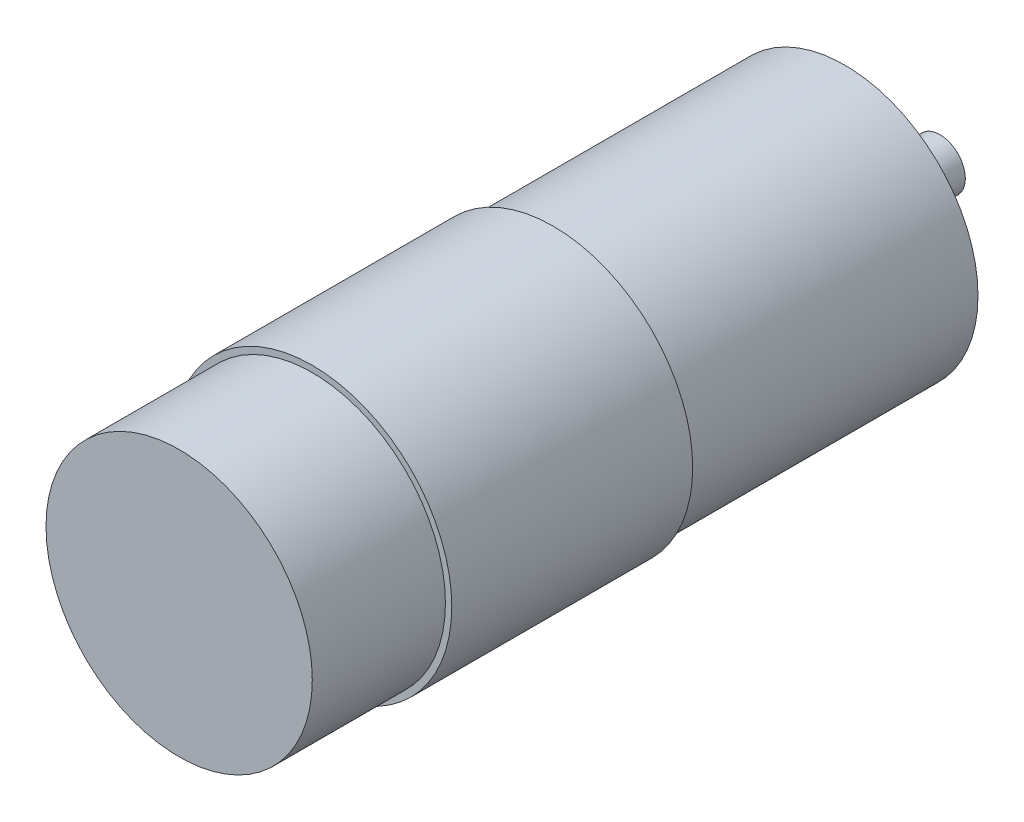
ISO-10303-21;
HEADER;
FILE_DESCRIPTION(('STEP AP214'),'2;1');
FILE_NAME('part.step','',(''),(''),'','','');
FILE_SCHEMA(('AUTOMOTIVE_DESIGN { 1 0 10303 214 1 1 1 1 }'));
ENDSEC;
DATA;
#1=APPLICATION_CONTEXT('core data for automotive mechanical design processes');
#2=APPLICATION_PROTOCOL_DEFINITION('international standard','automotive_design',2000,#1);
#3=PRODUCT_CONTEXT('',#1,'mechanical');
#4=PRODUCT('Part','Part','',(#3));
#5=PRODUCT_RELATED_PRODUCT_CATEGORY('part','',(#4));
#6=PRODUCT_DEFINITION_FORMATION('','',#4);
#7=PRODUCT_DEFINITION_CONTEXT('part definition',#1,'design');
#8=PRODUCT_DEFINITION('design','',#6,#7);
#9=PRODUCT_DEFINITION_SHAPE('','',#8);
#10=(LENGTH_UNIT() NAMED_UNIT(*) SI_UNIT(.MILLI.,.METRE.));
#11=(NAMED_UNIT(*) PLANE_ANGLE_UNIT() SI_UNIT($,.RADIAN.));
#12=(NAMED_UNIT(*) SI_UNIT($,.STERADIAN.) SOLID_ANGLE_UNIT());
#13=UNCERTAINTY_MEASURE_WITH_UNIT(LENGTH_MEASURE(1.E-05),#10,'distance_accuracy_value','');
#14=(GEOMETRIC_REPRESENTATION_CONTEXT(3) GLOBAL_UNCERTAINTY_ASSIGNED_CONTEXT((#13)) GLOBAL_UNIT_ASSIGNED_CONTEXT((#10,
#11,#12)) REPRESENTATION_CONTEXT('',''));
#15=CARTESIAN_POINT('',(0.,0.,0.));
#16=DIRECTION('',(0.,0.,1.));
#17=DIRECTION('',(1.,0.,0.));
#18=AXIS2_PLACEMENT_3D('',#15,#16,#17);
#19=CARTESIAN_POINT('',(0.,0.,105.));
#20=DIRECTION('',(0.,0.,-1.));
#21=DIRECTION('',(-1.,0.,0.));
#22=AXIS2_PLACEMENT_3D('',#19,#20,#21);
#23=CYLINDRICAL_SURFACE('',#22,21.);
#24=CARTESIAN_POINT('',(0.,0.,105.));
#25=DIRECTION('',(0.,0.,1.));
#26=DIRECTION('',(1.,0.,0.));
#27=AXIS2_PLACEMENT_3D('',#24,#25,#26);
#28=CIRCLE('',#27,21.);
#29=CARTESIAN_POINT('',(21.,0.,105.));
#30=VERTEX_POINT('',#29);
#31=EDGE_CURVE('E65',#30,#30,#28,.T.);
#32=ORIENTED_EDGE('',*,*,#31,.F.);
#33=EDGE_LOOP('',(#32));
#34=FACE_BOUND('',#33,.T.);
#35=CARTESIAN_POINT('',(0.,0.,84.));
#36=DIRECTION('',(0.,0.,-1.));
#37=DIRECTION('',(-1.,0.,0.));
#38=AXIS2_PLACEMENT_3D('',#35,#36,#37);
#39=CIRCLE('',#38,21.);
#40=CARTESIAN_POINT('',(-21.,0.,84.));
#41=VERTEX_POINT('',#40);
#42=EDGE_CURVE('E11',#41,#41,#39,.T.);
#43=ORIENTED_EDGE('',*,*,#42,.F.);
#44=EDGE_LOOP('',(#43));
#45=FACE_BOUND('',#44,.T.);
#46=ADVANCED_FACE('F57',(#34,#45),#23,.T.);
#47=CARTESIAN_POINT('',(0.,0.,105.));
#48=DIRECTION('',(0.,0.,1.));
#49=DIRECTION('',(1.,0.,0.));
#50=AXIS2_PLACEMENT_3D('',#47,#48,#49);
#51=PLANE('',#50);
#52=ORIENTED_EDGE('',*,*,#31,.T.);
#53=EDGE_LOOP('',(#52));
#54=FACE_BOUND('',#53,.T.);
#55=ADVANCED_FACE('F174',(#54),#51,.T.);
#56=CARTESIAN_POINT('',(0.,0.,84.));
#57=DIRECTION('',(0.,0.,-1.));
#58=DIRECTION('',(-1.,0.,0.));
#59=AXIS2_PLACEMENT_3D('',#56,#57,#58);
#60=CYLINDRICAL_SURFACE('',#59,22.);
#61=CARTESIAN_POINT('',(0.,0.,84.));
#62=DIRECTION('',(0.,0.,-1.));
#63=DIRECTION('',(-1.,0.,0.));
#64=AXIS2_PLACEMENT_3D('',#61,#62,#63);
#65=CIRCLE('',#64,22.);
#66=CARTESIAN_POINT('',(-22.,0.,84.));
#67=VERTEX_POINT('',#66);
#68=EDGE_CURVE('E83',#67,#67,#65,.T.);
#69=ORIENTED_EDGE('',*,*,#68,.T.);
#70=EDGE_LOOP('',(#69));
#71=FACE_BOUND('',#70,.T.);
#72=CARTESIAN_POINT('',(0.,0.,46.));
#73=DIRECTION('',(0.,0.,-1.));
#74=DIRECTION('',(-1.,0.,0.));
#75=AXIS2_PLACEMENT_3D('',#72,#73,#74);
#76=CIRCLE('',#75,22.);
#77=CARTESIAN_POINT('',(-22.,0.,46.));
#78=VERTEX_POINT('',#77);
#79=EDGE_CURVE('E79',#78,#78,#76,.T.);
#80=ORIENTED_EDGE('',*,*,#79,.F.);
#81=EDGE_LOOP('',(#80));
#82=FACE_BOUND('',#81,.T.);
#83=ADVANCED_FACE('F179',(#71,#82),#60,.T.);
#84=CARTESIAN_POINT('',(0.,0.,84.));
#85=DIRECTION('',(0.,0.,-1.));
#86=DIRECTION('',(-1.,0.,0.));
#87=AXIS2_PLACEMENT_3D('',#84,#85,#86);
#88=PLANE('',#87);
#89=ORIENTED_EDGE('',*,*,#42,.T.);
#90=EDGE_LOOP('',(#89));
#91=FACE_BOUND('',#90,.T.);
#92=ORIENTED_EDGE('',*,*,#68,.F.);
#93=EDGE_LOOP('',(#92));
#94=FACE_BOUND('',#93,.T.);
#95=ADVANCED_FACE('F185',(#91,#94),#88,.F.);
#96=CARTESIAN_POINT('',(0.,0.,46.));
#97=DIRECTION('',(0.,0.,-1.));
#98=DIRECTION('',(-1.,0.,0.));
#99=AXIS2_PLACEMENT_3D('',#96,#97,#98);
#100=PLANE('',#99);
#101=CARTESIAN_POINT('',(0.,0.,46.));
#102=DIRECTION('',(0.,0.,-1.));
#103=DIRECTION('',(-1.,0.,0.));
#104=AXIS2_PLACEMENT_3D('',#101,#102,#103);
#105=CIRCLE('',#104,21.);
#106=CARTESIAN_POINT('',(-21.,0.,46.));
#107=VERTEX_POINT('',#106);
#108=EDGE_CURVE('E76',#107,#107,#105,.T.);
#109=ORIENTED_EDGE('',*,*,#108,.F.);
#110=EDGE_LOOP('',(#109));
#111=FACE_BOUND('',#110,.T.);
#112=ORIENTED_EDGE('',*,*,#79,.T.);
#113=EDGE_LOOP('',(#112));
#114=FACE_BOUND('',#113,.T.);
#115=ADVANCED_FACE('F154',(#111,#114),#100,.T.);
#116=CARTESIAN_POINT('',(0.,0.,0.));
#117=DIRECTION('',(0.,0.,1.));
#118=DIRECTION('',(1.,0.,0.));
#119=AXIS2_PLACEMENT_3D('',#116,#117,#118);
#120=PLANE('',#119);
#121=CARTESIAN_POINT('',(17.5,0.,0.));
#122=DIRECTION('',(0.,0.,-1.));
#123=DIRECTION('',(0.,-1.,0.));
#124=AXIS2_PLACEMENT_3D('',#121,#122,#123);
#125=CIRCLE('',#124,1.5);
#126=CARTESIAN_POINT('',(16.,0.,0.));
#127=VERTEX_POINT('',#126);
#128=EDGE_CURVE('E134',#127,#127,#125,.T.);
#129=ORIENTED_EDGE('',*,*,#128,.F.);
#130=EDGE_LOOP('',(#129));
#131=FACE_BOUND('',#130,.T.);
#132=CARTESIAN_POINT('',(0.,17.5,0.));
#133=DIRECTION('',(0.,0.,-1.));
#134=DIRECTION('',(1.,0.,0.));
#135=AXIS2_PLACEMENT_3D('',#132,#133,#134);
#136=CIRCLE('',#135,1.5);
#137=CARTESIAN_POINT('',(-1.5,17.5,0.));
#138=VERTEX_POINT('',#137);
#139=EDGE_CURVE('E126',#138,#138,#136,.T.);
#140=ORIENTED_EDGE('',*,*,#139,.F.);
#141=EDGE_LOOP('',(#140));
#142=FACE_BOUND('',#141,.T.);
#143=CARTESIAN_POINT('',(-17.5,-1.83302770289265E-13,0.));
#144=DIRECTION('',(0.,0.,-1.));
#145=DIRECTION('',(0.,1.,0.));
#146=AXIS2_PLACEMENT_3D('',#143,#144,#145);
#147=CIRCLE('',#146,1.5);
#148=CARTESIAN_POINT('',(-19.,-1.83302770289265E-13,0.));
#149=VERTEX_POINT('',#148);
#150=EDGE_CURVE('E118',#149,#149,#147,.T.);
#151=ORIENTED_EDGE('',*,*,#150,.F.);
#152=EDGE_LOOP('',(#151));
#153=FACE_BOUND('',#152,.T.);
#154=CARTESIAN_POINT('',(0.,-17.5,0.));
#155=DIRECTION('',(0.,0.,-1.));
#156=DIRECTION('',(-1.,0.,0.));
#157=AXIS2_PLACEMENT_3D('',#154,#155,#156);
#158=CIRCLE('',#157,1.5);
#159=CARTESIAN_POINT('',(-1.5,-17.5,0.));
#160=VERTEX_POINT('',#159);
#161=EDGE_CURVE('E110',#160,#160,#158,.T.);
#162=ORIENTED_EDGE('',*,*,#161,.F.);
#163=EDGE_LOOP('',(#162));
#164=FACE_BOUND('',#163,.T.);
#165=CARTESIAN_POINT('',(0.,0.,0.));
#166=DIRECTION('',(0.,0.,1.));
#167=DIRECTION('',(1.,0.,0.));
#168=AXIS2_PLACEMENT_3D('',#165,#166,#167);
#169=CIRCLE('',#168,12.5);
#170=CARTESIAN_POINT('',(12.5,0.,0.));
#171=VERTEX_POINT('',#170);
#172=EDGE_CURVE('E94',#171,#171,#169,.T.);
#173=ORIENTED_EDGE('',*,*,#172,.T.);
#174=EDGE_LOOP('',(#173));
#175=FACE_BOUND('',#174,.T.);
#176=CARTESIAN_POINT('',(0.,0.,0.));
#177=DIRECTION('',(0.,0.,1.));
#178=DIRECTION('',(1.,0.,0.));
#179=AXIS2_PLACEMENT_3D('',#176,#177,#178);
#180=CIRCLE('',#179,21.);
#181=CARTESIAN_POINT('',(21.,0.,0.));
#182=VERTEX_POINT('',#181);
#183=EDGE_CURVE('E70',#182,#182,#180,.T.);
#184=ORIENTED_EDGE('',*,*,#183,.F.);
#185=EDGE_LOOP('',(#184));
#186=FACE_BOUND('',#185,.T.);
#187=ADVANCED_FACE('F151',(#131,#142,#153,#164,#175,#186),#120,.F.);
#188=ORIENTED_EDGE('',*,*,#108,.T.);
#189=EDGE_LOOP('',(#188));
#190=FACE_BOUND('',#189,.T.);
#191=ORIENTED_EDGE('',*,*,#183,.T.);
#192=EDGE_LOOP('',(#191));
#193=FACE_BOUND('',#192,.T.);
#194=ADVANCED_FACE('F59',(#190,#193),#23,.T.);
#195=CARTESIAN_POINT('',(0.,0.,-2.));
#196=DIRECTION('',(0.,0.,1.));
#197=DIRECTION('',(1.,0.,0.));
#198=AXIS2_PLACEMENT_3D('',#195,#196,#197);
#199=CYLINDRICAL_SURFACE('',#198,12.5);
#200=CARTESIAN_POINT('',(0.,0.,-2.));
#201=DIRECTION('',(0.,0.,1.));
#202=DIRECTION('',(1.,0.,0.));
#203=AXIS2_PLACEMENT_3D('',#200,#201,#202);
#204=CIRCLE('',#203,12.5);
#205=CARTESIAN_POINT('',(12.5,0.,-2.));
#206=VERTEX_POINT('',#205);
#207=EDGE_CURVE('E92',#206,#206,#204,.T.);
#208=ORIENTED_EDGE('',*,*,#207,.T.);
#209=EDGE_LOOP('',(#208));
#210=FACE_BOUND('',#209,.T.);
#211=ORIENTED_EDGE('',*,*,#172,.F.);
#212=EDGE_LOOP('',(#211));
#213=FACE_BOUND('',#212,.T.);
#214=ADVANCED_FACE('F166',(#210,#213),#199,.T.);
#215=CARTESIAN_POINT('',(0.,0.,-2.));
#216=DIRECTION('',(0.,0.,1.));
#217=DIRECTION('',(1.,0.,0.));
#218=AXIS2_PLACEMENT_3D('',#215,#216,#217);
#219=PLANE('',#218);
#220=CARTESIAN_POINT('',(0.,0.,-2.));
#221=DIRECTION('',(0.,0.,1.));
#222=DIRECTION('',(1.,0.,0.));
#223=AXIS2_PLACEMENT_3D('',#220,#221,#222);
#224=CIRCLE('',#223,4.);
#225=CARTESIAN_POINT('',(4.,0.,-2.));
#226=VERTEX_POINT('',#225);
#227=EDGE_CURVE('E102',#226,#226,#224,.T.);
#228=ORIENTED_EDGE('',*,*,#227,.T.);
#229=EDGE_LOOP('',(#228));
#230=FACE_BOUND('',#229,.T.);
#231=ORIENTED_EDGE('',*,*,#207,.F.);
#232=EDGE_LOOP('',(#231));
#233=FACE_BOUND('',#232,.T.);
#234=ADVANCED_FACE('F170',(#230,#233),#219,.F.);
#235=CARTESIAN_POINT('',(0.,0.,-15.));
#236=DIRECTION('',(0.,0.,1.));
#237=DIRECTION('',(1.,0.,0.));
#238=AXIS2_PLACEMENT_3D('',#235,#236,#237);
#239=CYLINDRICAL_SURFACE('',#238,4.);
#240=CARTESIAN_POINT('',(0.,0.,-15.));
#241=DIRECTION('',(0.,0.,1.));
#242=DIRECTION('',(1.,0.,0.));
#243=AXIS2_PLACEMENT_3D('',#240,#241,#242);
#244=CIRCLE('',#243,4.);
#245=CARTESIAN_POINT('',(4.,0.,-15.));
#246=VERTEX_POINT('',#245);
#247=EDGE_CURVE('E98',#246,#246,#244,.T.);
#248=CARTESIAN_POINT('',(4.,0.,-15.));
#249=CARTESIAN_POINT('',(4.,0.,-14.8645833333333));
#250=CARTESIAN_POINT('',(4.,0.,-14.7291666666667));
#251=CARTESIAN_POINT('',(4.,0.,-14.4583333333333));
#252=CARTESIAN_POINT('',(4.,0.,-14.3229166666667));
#253=CARTESIAN_POINT('',(4.,0.,-14.0520833333333));
#254=CARTESIAN_POINT('',(4.,0.,-13.9166666666667));
#255=CARTESIAN_POINT('',(4.,0.,-13.6458333333333));
#256=CARTESIAN_POINT('',(4.,0.,-13.5104166666667));
#257=CARTESIAN_POINT('',(4.,0.,-13.2395833333333));
#258=CARTESIAN_POINT('',(4.,0.,-13.1041666666667));
#259=CARTESIAN_POINT('',(4.,0.,-12.8333333333333));
#260=CARTESIAN_POINT('',(4.,0.,-12.6979166666667));
#261=CARTESIAN_POINT('',(4.,0.,-12.4270833333333));
#262=CARTESIAN_POINT('',(4.,0.,-12.2916666666667));
#263=CARTESIAN_POINT('',(4.,0.,-12.0208333333333));
#264=CARTESIAN_POINT('',(4.,0.,-11.8854166666667));
#265=CARTESIAN_POINT('',(4.,0.,-11.6145833333333));
#266=CARTESIAN_POINT('',(4.,0.,-11.4791666666667));
#267=CARTESIAN_POINT('',(4.,0.,-11.2083333333333));
#268=CARTESIAN_POINT('',(4.,0.,-11.0729166666667));
#269=CARTESIAN_POINT('',(4.,0.,-10.8020833333333));
#270=CARTESIAN_POINT('',(4.,0.,-10.6666666666667));
#271=CARTESIAN_POINT('',(4.,0.,-10.3958333333333));
#272=CARTESIAN_POINT('',(4.,0.,-10.2604166666667));
#273=CARTESIAN_POINT('',(4.,0.,-9.98958333333333));
#274=CARTESIAN_POINT('',(4.,0.,-9.85416666666667));
#275=CARTESIAN_POINT('',(4.,0.,-9.58333333333333));
#276=CARTESIAN_POINT('',(4.,0.,-9.44791666666667));
#277=CARTESIAN_POINT('',(4.,0.,-9.17708333333333));
#278=CARTESIAN_POINT('',(4.,0.,-9.04166666666667));
#279=CARTESIAN_POINT('',(4.,0.,-8.77083333333333));
#280=CARTESIAN_POINT('',(4.,0.,-8.63541666666667));
#281=CARTESIAN_POINT('',(4.,0.,-8.36458333333333));
#282=CARTESIAN_POINT('',(4.,0.,-8.22916666666667));
#283=CARTESIAN_POINT('',(4.,0.,-7.95833333333333));
#284=CARTESIAN_POINT('',(4.,0.,-7.82291666666667));
#285=CARTESIAN_POINT('',(4.,0.,-7.55208333333333));
#286=CARTESIAN_POINT('',(4.,0.,-7.41666666666667));
#287=CARTESIAN_POINT('',(4.,0.,-7.14583333333333));
#288=CARTESIAN_POINT('',(4.,0.,-7.01041666666667));
#289=CARTESIAN_POINT('',(4.,0.,-6.73958333333333));
#290=CARTESIAN_POINT('',(4.,0.,-6.60416666666667));
#291=CARTESIAN_POINT('',(4.,0.,-6.33333333333333));
#292=CARTESIAN_POINT('',(4.,0.,-6.19791666666667));
#293=CARTESIAN_POINT('',(4.,0.,-5.92708333333333));
#294=CARTESIAN_POINT('',(4.,0.,-5.79166666666667));
#295=CARTESIAN_POINT('',(4.,0.,-5.52083333333333));
#296=CARTESIAN_POINT('',(4.,0.,-5.38541666666667));
#297=CARTESIAN_POINT('',(4.,0.,-5.11458333333333));
#298=CARTESIAN_POINT('',(4.,0.,-4.97916666666667));
#299=CARTESIAN_POINT('',(4.,0.,-4.70833333333333));
#300=CARTESIAN_POINT('',(4.,0.,-4.57291666666667));
#301=CARTESIAN_POINT('',(4.,0.,-4.30208333333333));
#302=CARTESIAN_POINT('',(4.,0.,-4.16666666666667));
#303=CARTESIAN_POINT('',(4.,0.,-3.89583333333333));
#304=CARTESIAN_POINT('',(4.,0.,-3.76041666666667));
#305=CARTESIAN_POINT('',(4.,0.,-3.48958333333333));
#306=CARTESIAN_POINT('',(4.,0.,-3.35416666666667));
#307=CARTESIAN_POINT('',(4.,0.,-3.08333333333333));
#308=CARTESIAN_POINT('',(4.,0.,-2.94791666666667));
#309=CARTESIAN_POINT('',(4.,0.,-2.67708333333333));
#310=CARTESIAN_POINT('',(4.,0.,-2.54166666666667));
#311=CARTESIAN_POINT('',(4.,0.,-2.27083333333333));
#312=CARTESIAN_POINT('',(4.,0.,-2.13541666666667));
#313=CARTESIAN_POINT('',(4.,0.,-2.));
#314=B_SPLINE_CURVE_WITH_KNOTS('',3,(#248,#249,#250,#251,#252,#253,#254,#255,#256,#257,#258,
#259,#260,#261,#262,#263,#264,#265,#266,#267,#268,#269,#270,#271,#272,#273,#274,#275,#276,#277,
#278,#279,#280,#281,#282,#283,#284,#285,#286,#287,#288,#289,#290,#291,#292,#293,#294,#295,#296,
#297,#298,#299,#300,#301,#302,#303,#304,#305,#306,#307,#308,#309,#310,#311,#312,#313),
.UNSPECIFIED.,.F.,.F.,(4,2,2,2,2,2,2,2,2,2,2,2,2,2,2,2,2,2,2,2,2,2,2,2,2,2,2,2,2,2,2,2,4),(0.,
0.406249999999999,0.812499999999999,1.21875,1.625,2.03125,2.4375,2.84375,3.25,3.65625,4.0625,
4.46875,4.875,5.28125,5.6875,6.09375,6.5,6.90625,7.3125,7.71875,8.125,8.53125,8.9375,9.34375,
9.75,10.15625,10.5625,10.96875,11.375,11.78125,12.1875,12.59375,13.),.UNSPECIFIED.);
#315=EDGE_CURVE('BSEAM195',#246,#226,#314,.T.);
#316=ORIENTED_EDGE('',*,*,#247,.T.);
#317=ORIENTED_EDGE('',*,*,#227,.F.);
#318=ORIENTED_EDGE('',*,*,#315,.T.);
#319=ORIENTED_EDGE('',*,*,#315,.F.);
#320=EDGE_LOOP('',(#316,#318,#317,#319));
#321=FACE_BOUND('',#320,.T.);
#322=ADVANCED_FACE('F195',(#321),#239,.T.);
#323=CARTESIAN_POINT('',(0.,0.,-15.));
#324=DIRECTION('',(0.,0.,1.));
#325=DIRECTION('',(1.,0.,0.));
#326=AXIS2_PLACEMENT_3D('',#323,#324,#325);
#327=PLANE('',#326);
#328=ORIENTED_EDGE('',*,*,#247,.F.);
#329=EDGE_LOOP('',(#328));
#330=FACE_BOUND('',#329,.T.);
#331=ADVANCED_FACE('F199',(#330),#327,.F.);
#332=CARTESIAN_POINT('',(0.,-17.5,6.5));
#333=DIRECTION('',(0.,0.,-1.));
#334=DIRECTION('',(-1.,0.,0.));
#335=AXIS2_PLACEMENT_3D('',#332,#333,#334);
#336=CYLINDRICAL_SURFACE('',#335,1.5);
#337=CARTESIAN_POINT('',(0.,-17.5,6.5));
#338=DIRECTION('',(0.,0.,-1.));
#339=DIRECTION('',(-1.,0.,0.));
#340=AXIS2_PLACEMENT_3D('',#337,#338,#339);
#341=CIRCLE('',#340,1.5);
#342=CARTESIAN_POINT('',(-1.5,-17.5,6.5));
#343=VERTEX_POINT('',#342);
#344=EDGE_CURVE('E106',#343,#343,#341,.T.);
#345=CARTESIAN_POINT('',(-1.5,-17.5,6.5));
#346=CARTESIAN_POINT('',(-1.5,-17.5,6.43229166666667));
#347=CARTESIAN_POINT('',(-1.5,-17.5,6.36458333333333));
#348=CARTESIAN_POINT('',(-1.5,-17.5,6.22916666666667));
#349=CARTESIAN_POINT('',(-1.5,-17.5,6.16145833333333));
#350=CARTESIAN_POINT('',(-1.5,-17.5,6.02604166666667));
#351=CARTESIAN_POINT('',(-1.5,-17.5,5.95833333333333));
#352=CARTESIAN_POINT('',(-1.5,-17.5,5.82291666666667));
#353=CARTESIAN_POINT('',(-1.5,-17.5,5.75520833333333));
#354=CARTESIAN_POINT('',(-1.5,-17.5,5.61979166666667));
#355=CARTESIAN_POINT('',(-1.5,-17.5,5.55208333333333));
#356=CARTESIAN_POINT('',(-1.5,-17.5,5.41666666666667));
#357=CARTESIAN_POINT('',(-1.5,-17.5,5.34895833333333));
#358=CARTESIAN_POINT('',(-1.5,-17.5,5.21354166666667));
#359=CARTESIAN_POINT('',(-1.5,-17.5,5.14583333333333));
#360=CARTESIAN_POINT('',(-1.5,-17.5,5.01041666666667));
#361=CARTESIAN_POINT('',(-1.5,-17.5,4.94270833333333));
#362=CARTESIAN_POINT('',(-1.5,-17.5,4.80729166666667));
#363=CARTESIAN_POINT('',(-1.5,-17.5,4.73958333333333));
#364=CARTESIAN_POINT('',(-1.5,-17.5,4.60416666666667));
#365=CARTESIAN_POINT('',(-1.5,-17.5,4.53645833333333));
#366=CARTESIAN_POINT('',(-1.5,-17.5,4.40104166666667));
#367=CARTESIAN_POINT('',(-1.5,-17.5,4.33333333333333));
#368=CARTESIAN_POINT('',(-1.5,-17.5,4.19791666666667));
#369=CARTESIAN_POINT('',(-1.5,-17.5,4.13020833333333));
#370=CARTESIAN_POINT('',(-1.5,-17.5,3.99479166666667));
#371=CARTESIAN_POINT('',(-1.5,-17.5,3.92708333333333));
#372=CARTESIAN_POINT('',(-1.5,-17.5,3.79166666666667));
#373=CARTESIAN_POINT('',(-1.5,-17.5,3.72395833333333));
#374=CARTESIAN_POINT('',(-1.5,-17.5,3.58854166666667));
#375=CARTESIAN_POINT('',(-1.5,-17.5,3.52083333333333));
#376=CARTESIAN_POINT('',(-1.5,-17.5,3.38541666666667));
#377=CARTESIAN_POINT('',(-1.5,-17.5,3.31770833333333));
#378=CARTESIAN_POINT('',(-1.5,-17.5,3.18229166666667));
#379=CARTESIAN_POINT('',(-1.5,-17.5,3.11458333333333));
#380=CARTESIAN_POINT('',(-1.5,-17.5,2.97916666666667));
#381=CARTESIAN_POINT('',(-1.5,-17.5,2.91145833333333));
#382=CARTESIAN_POINT('',(-1.5,-17.5,2.77604166666667));
#383=CARTESIAN_POINT('',(-1.5,-17.5,2.70833333333333));
#384=CARTESIAN_POINT('',(-1.5,-17.5,2.57291666666667));
#385=CARTESIAN_POINT('',(-1.5,-17.5,2.50520833333333));
#386=CARTESIAN_POINT('',(-1.5,-17.5,2.36979166666667));
#387=CARTESIAN_POINT('',(-1.5,-17.5,2.30208333333333));
#388=CARTESIAN_POINT('',(-1.5,-17.5,2.16666666666667));
#389=CARTESIAN_POINT('',(-1.5,-17.5,2.09895833333333));
#390=CARTESIAN_POINT('',(-1.5,-17.5,1.96354166666667));
#391=CARTESIAN_POINT('',(-1.5,-17.5,1.89583333333333));
#392=CARTESIAN_POINT('',(-1.5,-17.5,1.76041666666667));
#393=CARTESIAN_POINT('',(-1.5,-17.5,1.69270833333333));
#394=CARTESIAN_POINT('',(-1.5,-17.5,1.55729166666667));
#395=CARTESIAN_POINT('',(-1.5,-17.5,1.48958333333333));
#396=CARTESIAN_POINT('',(-1.5,-17.5,1.35416666666667));
#397=CARTESIAN_POINT('',(-1.5,-17.5,1.28645833333333));
#398=CARTESIAN_POINT('',(-1.5,-17.5,1.15104166666667));
#399=CARTESIAN_POINT('',(-1.5,-17.5,1.08333333333333));
#400=CARTESIAN_POINT('',(-1.5,-17.5,0.947916666666667));
#401=CARTESIAN_POINT('',(-1.5,-17.5,0.880208333333333));
#402=CARTESIAN_POINT('',(-1.5,-17.5,0.744791666666667));
#403=CARTESIAN_POINT('',(-1.5,-17.5,0.677083333333333));
#404=CARTESIAN_POINT('',(-1.5,-17.5,0.541666666666667));
#405=CARTESIAN_POINT('',(-1.5,-17.5,0.473958333333333));
#406=CARTESIAN_POINT('',(-1.5,-17.5,0.338541666666667));
#407=CARTESIAN_POINT('',(-1.5,-17.5,0.270833333333334));
#408=CARTESIAN_POINT('',(-1.5,-17.5,0.135416666666667));
#409=CARTESIAN_POINT('',(-1.5,-17.5,0.0677083333333334));
#410=CARTESIAN_POINT('',(-1.5,-17.5,0.));
#411=B_SPLINE_CURVE_WITH_KNOTS('',3,(#345,#346,#347,#348,#349,#350,#351,#352,#353,#354,#355,
#356,#357,#358,#359,#360,#361,#362,#363,#364,#365,#366,#367,#368,#369,#370,#371,#372,#373,#374,
#375,#376,#377,#378,#379,#380,#381,#382,#383,#384,#385,#386,#387,#388,#389,#390,#391,#392,#393,
#394,#395,#396,#397,#398,#399,#400,#401,#402,#403,#404,#405,#406,#407,#408,#409,#410),
.UNSPECIFIED.,.F.,.F.,(4,2,2,2,2,2,2,2,2,2,2,2,2,2,2,2,2,2,2,2,2,2,2,2,2,2,2,2,2,2,2,2,4),(0.,
0.203124999999999,0.40625,0.609375,0.8125,1.015625,1.21875,1.421875,1.625,1.828125,2.03125,
2.234375,2.4375,2.640625,2.84375,3.046875,3.25,3.453125,3.65625,3.859375,4.0625,4.265625,
4.46875,4.671875,4.875,5.078125,5.28125,5.484375,5.6875,5.890625,6.09375,6.296875,6.5),.UNSPECIFIED.);
#412=EDGE_CURVE('BSEAM203',#343,#160,#411,.T.);
#413=ORIENTED_EDGE('',*,*,#344,.F.);
#414=ORIENTED_EDGE('',*,*,#161,.T.);
#415=ORIENTED_EDGE('',*,*,#412,.T.);
#416=ORIENTED_EDGE('',*,*,#412,.F.);
#417=EDGE_LOOP('',(#413,#415,#414,#416));
#418=FACE_BOUND('',#417,.T.);
#419=ADVANCED_FACE('F203',(#418),#336,.F.);
#420=CARTESIAN_POINT('',(0.,0.,6.5));
#421=DIRECTION('',(0.,0.,-1.));
#422=DIRECTION('',(-1.,0.,0.));
#423=AXIS2_PLACEMENT_3D('',#420,#421,#422);
#424=PLANE('',#423);
#425=ORIENTED_EDGE('',*,*,#344,.T.);
#426=EDGE_LOOP('',(#425));
#427=FACE_BOUND('',#426,.T.);
#428=ADVANCED_FACE('F207',(#427),#424,.T.);
#429=CARTESIAN_POINT('',(-17.5,-1.83302770289265E-13,6.5));
#430=DIRECTION('',(0.,0.,-1.));
#431=DIRECTION('',(-1.,0.,0.));
#432=AXIS2_PLACEMENT_3D('',#429,#430,#431);
#433=CYLINDRICAL_SURFACE('',#432,1.5);
#434=CARTESIAN_POINT('',(-17.5,-1.83302770289265E-13,6.5));
#435=DIRECTION('',(0.,0.,-1.));
#436=DIRECTION('',(0.,1.,0.));
#437=AXIS2_PLACEMENT_3D('',#434,#435,#436);
#438=CIRCLE('',#437,1.5);
#439=CARTESIAN_POINT('',(-19.,-1.83302770289265E-13,6.5));
#440=VERTEX_POINT('',#439);
#441=EDGE_CURVE('E122',#440,#440,#438,.T.);
#442=CARTESIAN_POINT('',(-19.,-1.83302770289265E-13,6.5));
#443=CARTESIAN_POINT('',(-19.,-1.83302770289265E-13,6.43229166666667));
#444=CARTESIAN_POINT('',(-19.,-1.83302770289265E-13,6.36458333333333));
#445=CARTESIAN_POINT('',(-19.,-1.83302770289265E-13,6.22916666666667));
#446=CARTESIAN_POINT('',(-19.,-1.83302770289265E-13,6.16145833333333));
#447=CARTESIAN_POINT('',(-19.,-1.83302770289265E-13,6.02604166666667));
#448=CARTESIAN_POINT('',(-19.,-1.83302770289265E-13,5.95833333333333));
#449=CARTESIAN_POINT('',(-19.,-1.83302770289265E-13,5.82291666666667));
#450=CARTESIAN_POINT('',(-19.,-1.83302770289265E-13,5.75520833333333));
#451=CARTESIAN_POINT('',(-19.,-1.83302770289265E-13,5.61979166666667));
#452=CARTESIAN_POINT('',(-19.,-1.83302770289265E-13,5.55208333333333));
#453=CARTESIAN_POINT('',(-19.,-1.83302770289265E-13,5.41666666666667));
#454=CARTESIAN_POINT('',(-19.,-1.83302770289265E-13,5.34895833333333));
#455=CARTESIAN_POINT('',(-19.,-1.83302770289265E-13,5.21354166666667));
#456=CARTESIAN_POINT('',(-19.,-1.83302770289265E-13,5.14583333333333));
#457=CARTESIAN_POINT('',(-19.,-1.83302770289265E-13,5.01041666666667));
#458=CARTESIAN_POINT('',(-19.,-1.83302770289265E-13,4.94270833333333));
#459=CARTESIAN_POINT('',(-19.,-1.83302770289265E-13,4.80729166666667));
#460=CARTESIAN_POINT('',(-19.,-1.83302770289265E-13,4.73958333333333));
#461=CARTESIAN_POINT('',(-19.,-1.83302770289265E-13,4.60416666666667));
#462=CARTESIAN_POINT('',(-19.,-1.83302770289265E-13,4.53645833333333));
#463=CARTESIAN_POINT('',(-19.,-1.83302770289265E-13,4.40104166666667));
#464=CARTESIAN_POINT('',(-19.,-1.83302770289265E-13,4.33333333333333));
#465=CARTESIAN_POINT('',(-19.,-1.83302770289265E-13,4.19791666666667));
#466=CARTESIAN_POINT('',(-19.,-1.83302770289265E-13,4.13020833333333));
#467=CARTESIAN_POINT('',(-19.,-1.83302770289265E-13,3.99479166666667));
#468=CARTESIAN_POINT('',(-19.,-1.83302770289265E-13,3.92708333333333));
#469=CARTESIAN_POINT('',(-19.,-1.83302770289265E-13,3.79166666666667));
#470=CARTESIAN_POINT('',(-19.,-1.83302770289265E-13,3.72395833333333));
#471=CARTESIAN_POINT('',(-19.,-1.83302770289265E-13,3.58854166666667));
#472=CARTESIAN_POINT('',(-19.,-1.83302770289265E-13,3.52083333333333));
#473=CARTESIAN_POINT('',(-19.,-1.83302770289265E-13,3.38541666666667));
#474=CARTESIAN_POINT('',(-19.,-1.83302770289265E-13,3.31770833333333));
#475=CARTESIAN_POINT('',(-19.,-1.83302770289265E-13,3.18229166666667));
#476=CARTESIAN_POINT('',(-19.,-1.83302770289265E-13,3.11458333333333));
#477=CARTESIAN_POINT('',(-19.,-1.83302770289265E-13,2.97916666666667));
#478=CARTESIAN_POINT('',(-19.,-1.83302770289265E-13,2.91145833333333));
#479=CARTESIAN_POINT('',(-19.,-1.83302770289265E-13,2.77604166666667));
#480=CARTESIAN_POINT('',(-19.,-1.83302770289265E-13,2.70833333333333));
#481=CARTESIAN_POINT('',(-19.,-1.83302770289265E-13,2.57291666666667));
#482=CARTESIAN_POINT('',(-19.,-1.83302770289265E-13,2.50520833333333));
#483=CARTESIAN_POINT('',(-19.,-1.83302770289265E-13,2.36979166666667));
#484=CARTESIAN_POINT('',(-19.,-1.83302770289265E-13,2.30208333333333));
#485=CARTESIAN_POINT('',(-19.,-1.83302770289265E-13,2.16666666666667));
#486=CARTESIAN_POINT('',(-19.,-1.83302770289265E-13,2.09895833333333));
#487=CARTESIAN_POINT('',(-19.,-1.83302770289265E-13,1.96354166666667));
#488=CARTESIAN_POINT('',(-19.,-1.83302770289265E-13,1.89583333333333));
#489=CARTESIAN_POINT('',(-19.,-1.83302770289265E-13,1.76041666666667));
#490=CARTESIAN_POINT('',(-19.,-1.83302770289265E-13,1.69270833333333));
#491=CARTESIAN_POINT('',(-19.,-1.83302770289265E-13,1.55729166666667));
#492=CARTESIAN_POINT('',(-19.,-1.83302770289265E-13,1.48958333333333));
#493=CARTESIAN_POINT('',(-19.,-1.83302770289265E-13,1.35416666666667));
#494=CARTESIAN_POINT('',(-19.,-1.83302770289265E-13,1.28645833333333));
#495=CARTESIAN_POINT('',(-19.,-1.83302770289265E-13,1.15104166666667));
#496=CARTESIAN_POINT('',(-19.,-1.83302770289265E-13,1.08333333333333));
#497=CARTESIAN_POINT('',(-19.,-1.83302770289265E-13,0.947916666666667));
#498=CARTESIAN_POINT('',(-19.,-1.83302770289265E-13,0.880208333333333));
#499=CARTESIAN_POINT('',(-19.,-1.83302770289265E-13,0.744791666666667));
#500=CARTESIAN_POINT('',(-19.,-1.83302770289265E-13,0.677083333333333));
#501=CARTESIAN_POINT('',(-19.,-1.83302770289265E-13,0.541666666666667));
#502=CARTESIAN_POINT('',(-19.,-1.83302770289265E-13,0.473958333333333));
#503=CARTESIAN_POINT('',(-19.,-1.83302770289265E-13,0.338541666666667));
#504=CARTESIAN_POINT('',(-19.,-1.83302770289265E-13,0.270833333333334));
#505=CARTESIAN_POINT('',(-19.,-1.83302770289265E-13,0.135416666666667));
#506=CARTESIAN_POINT('',(-19.,-1.83302770289265E-13,0.0677083333333334));
#507=CARTESIAN_POINT('',(-19.,-1.83302770289265E-13,0.));
#508=B_SPLINE_CURVE_WITH_KNOTS('',3,(#442,#443,#444,#445,#446,#447,#448,#449,#450,#451,#452,
#453,#454,#455,#456,#457,#458,#459,#460,#461,#462,#463,#464,#465,#466,#467,#468,#469,#470,#471,
#472,#473,#474,#475,#476,#477,#478,#479,#480,#481,#482,#483,#484,#485,#486,#487,#488,#489,#490,
#491,#492,#493,#494,#495,#496,#497,#498,#499,#500,#501,#502,#503,#504,#505,#506,#507),
.UNSPECIFIED.,.F.,.F.,(4,2,2,2,2,2,2,2,2,2,2,2,2,2,2,2,2,2,2,2,2,2,2,2,2,2,2,2,2,2,2,2,4),(0.,
0.203124999999999,0.40625,0.609375,0.8125,1.015625,1.21875,1.421875,1.625,1.828125,2.03125,
2.234375,2.4375,2.640625,2.84375,3.046875,3.25,3.453125,3.65625,3.859375,4.0625,4.265625,
4.46875,4.671875,4.875,5.078125,5.28125,5.484375,5.6875,5.890625,6.09375,6.296875,6.5),.UNSPECIFIED.);
#509=EDGE_CURVE('BSEAM211',#440,#149,#508,.T.);
#510=ORIENTED_EDGE('',*,*,#441,.F.);
#511=ORIENTED_EDGE('',*,*,#150,.T.);
#512=ORIENTED_EDGE('',*,*,#509,.T.);
#513=ORIENTED_EDGE('',*,*,#509,.F.);
#514=EDGE_LOOP('',(#510,#512,#511,#513));
#515=FACE_BOUND('',#514,.T.);
#516=ADVANCED_FACE('F211',(#515),#433,.F.);
#517=CARTESIAN_POINT('',(0.,0.,6.5));
#518=DIRECTION('',(0.,0.,-1.));
#519=DIRECTION('',(0.,1.,0.));
#520=AXIS2_PLACEMENT_3D('',#517,#518,#519);
#521=PLANE('',#520);
#522=ORIENTED_EDGE('',*,*,#441,.T.);
#523=EDGE_LOOP('',(#522));
#524=FACE_BOUND('',#523,.T.);
#525=ADVANCED_FACE('F215',(#524),#521,.T.);
#526=CARTESIAN_POINT('',(0.,17.5,6.5));
#527=DIRECTION('',(0.,0.,-1.));
#528=DIRECTION('',(-1.,0.,0.));
#529=AXIS2_PLACEMENT_3D('',#526,#527,#528);
#530=CYLINDRICAL_SURFACE('',#529,1.5);
#531=CARTESIAN_POINT('',(0.,17.5,6.5));
#532=DIRECTION('',(0.,0.,-1.));
#533=DIRECTION('',(1.,0.,0.));
#534=AXIS2_PLACEMENT_3D('',#531,#532,#533);
#535=CIRCLE('',#534,1.5);
#536=CARTESIAN_POINT('',(-1.5,17.5,6.5));
#537=VERTEX_POINT('',#536);
#538=EDGE_CURVE('E130',#537,#537,#535,.T.);
#539=CARTESIAN_POINT('',(-1.5,17.5,6.5));
#540=CARTESIAN_POINT('',(-1.5,17.5,6.43229166666667));
#541=CARTESIAN_POINT('',(-1.5,17.5,6.36458333333333));
#542=CARTESIAN_POINT('',(-1.5,17.5,6.22916666666667));
#543=CARTESIAN_POINT('',(-1.5,17.5,6.16145833333333));
#544=CARTESIAN_POINT('',(-1.5,17.5,6.02604166666667));
#545=CARTESIAN_POINT('',(-1.5,17.5,5.95833333333333));
#546=CARTESIAN_POINT('',(-1.5,17.5,5.82291666666667));
#547=CARTESIAN_POINT('',(-1.5,17.5,5.75520833333333));
#548=CARTESIAN_POINT('',(-1.5,17.5,5.61979166666667));
#549=CARTESIAN_POINT('',(-1.5,17.5,5.55208333333333));
#550=CARTESIAN_POINT('',(-1.5,17.5,5.41666666666667));
#551=CARTESIAN_POINT('',(-1.5,17.5,5.34895833333333));
#552=CARTESIAN_POINT('',(-1.5,17.5,5.21354166666667));
#553=CARTESIAN_POINT('',(-1.5,17.5,5.14583333333333));
#554=CARTESIAN_POINT('',(-1.5,17.5,5.01041666666667));
#555=CARTESIAN_POINT('',(-1.5,17.5,4.94270833333333));
#556=CARTESIAN_POINT('',(-1.5,17.5,4.80729166666667));
#557=CARTESIAN_POINT('',(-1.5,17.5,4.73958333333333));
#558=CARTESIAN_POINT('',(-1.5,17.5,4.60416666666667));
#559=CARTESIAN_POINT('',(-1.5,17.5,4.53645833333333));
#560=CARTESIAN_POINT('',(-1.5,17.5,4.40104166666667));
#561=CARTESIAN_POINT('',(-1.5,17.5,4.33333333333333));
#562=CARTESIAN_POINT('',(-1.5,17.5,4.19791666666667));
#563=CARTESIAN_POINT('',(-1.5,17.5,4.13020833333333));
#564=CARTESIAN_POINT('',(-1.5,17.5,3.99479166666667));
#565=CARTESIAN_POINT('',(-1.5,17.5,3.92708333333333));
#566=CARTESIAN_POINT('',(-1.5,17.5,3.79166666666667));
#567=CARTESIAN_POINT('',(-1.5,17.5,3.72395833333333));
#568=CARTESIAN_POINT('',(-1.5,17.5,3.58854166666667));
#569=CARTESIAN_POINT('',(-1.5,17.5,3.52083333333333));
#570=CARTESIAN_POINT('',(-1.5,17.5,3.38541666666667));
#571=CARTESIAN_POINT('',(-1.5,17.5,3.31770833333333));
#572=CARTESIAN_POINT('',(-1.5,17.5,3.18229166666667));
#573=CARTESIAN_POINT('',(-1.5,17.5,3.11458333333333));
#574=CARTESIAN_POINT('',(-1.5,17.5,2.97916666666667));
#575=CARTESIAN_POINT('',(-1.5,17.5,2.91145833333333));
#576=CARTESIAN_POINT('',(-1.5,17.5,2.77604166666667));
#577=CARTESIAN_POINT('',(-1.5,17.5,2.70833333333333));
#578=CARTESIAN_POINT('',(-1.5,17.5,2.57291666666667));
#579=CARTESIAN_POINT('',(-1.5,17.5,2.50520833333333));
#580=CARTESIAN_POINT('',(-1.5,17.5,2.36979166666667));
#581=CARTESIAN_POINT('',(-1.5,17.5,2.30208333333333));
#582=CARTESIAN_POINT('',(-1.5,17.5,2.16666666666667));
#583=CARTESIAN_POINT('',(-1.5,17.5,2.09895833333333));
#584=CARTESIAN_POINT('',(-1.5,17.5,1.96354166666667));
#585=CARTESIAN_POINT('',(-1.5,17.5,1.89583333333333));
#586=CARTESIAN_POINT('',(-1.5,17.5,1.76041666666667));
#587=CARTESIAN_POINT('',(-1.5,17.5,1.69270833333333));
#588=CARTESIAN_POINT('',(-1.5,17.5,1.55729166666667));
#589=CARTESIAN_POINT('',(-1.5,17.5,1.48958333333333));
#590=CARTESIAN_POINT('',(-1.5,17.5,1.35416666666667));
#591=CARTESIAN_POINT('',(-1.5,17.5,1.28645833333333));
#592=CARTESIAN_POINT('',(-1.5,17.5,1.15104166666667));
#593=CARTESIAN_POINT('',(-1.5,17.5,1.08333333333333));
#594=CARTESIAN_POINT('',(-1.5,17.5,0.947916666666667));
#595=CARTESIAN_POINT('',(-1.5,17.5,0.880208333333333));
#596=CARTESIAN_POINT('',(-1.5,17.5,0.744791666666667));
#597=CARTESIAN_POINT('',(-1.5,17.5,0.677083333333333));
#598=CARTESIAN_POINT('',(-1.5,17.5,0.541666666666667));
#599=CARTESIAN_POINT('',(-1.5,17.5,0.473958333333333));
#600=CARTESIAN_POINT('',(-1.5,17.5,0.338541666666667));
#601=CARTESIAN_POINT('',(-1.5,17.5,0.270833333333334));
#602=CARTESIAN_POINT('',(-1.5,17.5,0.135416666666667));
#603=CARTESIAN_POINT('',(-1.5,17.5,0.0677083333333334));
#604=CARTESIAN_POINT('',(-1.5,17.5,0.));
#605=B_SPLINE_CURVE_WITH_KNOTS('',3,(#539,#540,#541,#542,#543,#544,#545,#546,#547,#548,#549,
#550,#551,#552,#553,#554,#555,#556,#557,#558,#559,#560,#561,#562,#563,#564,#565,#566,#567,#568,
#569,#570,#571,#572,#573,#574,#575,#576,#577,#578,#579,#580,#581,#582,#583,#584,#585,#586,#587,
#588,#589,#590,#591,#592,#593,#594,#595,#596,#597,#598,#599,#600,#601,#602,#603,#604),
.UNSPECIFIED.,.F.,.F.,(4,2,2,2,2,2,2,2,2,2,2,2,2,2,2,2,2,2,2,2,2,2,2,2,2,2,2,2,2,2,2,2,4),(0.,
0.203124999999999,0.40625,0.609375,0.8125,1.015625,1.21875,1.421875,1.625,1.828125,2.03125,
2.234375,2.4375,2.640625,2.84375,3.046875,3.25,3.453125,3.65625,3.859375,4.0625,4.265625,
4.46875,4.671875,4.875,5.078125,5.28125,5.484375,5.6875,5.890625,6.09375,6.296875,6.5),.UNSPECIFIED.);
#606=EDGE_CURVE('BSEAM219',#537,#138,#605,.T.);
#607=ORIENTED_EDGE('',*,*,#538,.F.);
#608=ORIENTED_EDGE('',*,*,#139,.T.);
#609=ORIENTED_EDGE('',*,*,#606,.T.);
#610=ORIENTED_EDGE('',*,*,#606,.F.);
#611=EDGE_LOOP('',(#607,#609,#608,#610));
#612=FACE_BOUND('',#611,.T.);
#613=ADVANCED_FACE('F219',(#612),#530,.F.);
#614=CARTESIAN_POINT('',(0.,0.,6.5));
#615=DIRECTION('',(0.,0.,-1.));
#616=DIRECTION('',(1.,0.,0.));
#617=AXIS2_PLACEMENT_3D('',#614,#615,#616);
#618=PLANE('',#617);
#619=ORIENTED_EDGE('',*,*,#538,.T.);
#620=EDGE_LOOP('',(#619));
#621=FACE_BOUND('',#620,.T.);
#622=ADVANCED_FACE('F147',(#621),#618,.T.);
#623=CARTESIAN_POINT('',(17.5,0.,6.5));
#624=DIRECTION('',(0.,0.,-1.));
#625=DIRECTION('',(-1.,0.,0.));
#626=AXIS2_PLACEMENT_3D('',#623,#624,#625);
#627=CYLINDRICAL_SURFACE('',#626,1.5);
#628=CARTESIAN_POINT('',(17.5,0.,6.5));
#629=DIRECTION('',(0.,0.,-1.));
#630=DIRECTION('',(0.,-1.,0.));
#631=AXIS2_PLACEMENT_3D('',#628,#629,#630);
#632=CIRCLE('',#631,1.5);
#633=CARTESIAN_POINT('',(16.,0.,6.5));
#634=VERTEX_POINT('',#633);
#635=EDGE_CURVE('E114',#634,#634,#632,.T.);
#636=CARTESIAN_POINT('',(16.,0.,6.5));
#637=CARTESIAN_POINT('',(16.,0.,6.43229166666667));
#638=CARTESIAN_POINT('',(16.,0.,6.36458333333333));
#639=CARTESIAN_POINT('',(16.,0.,6.22916666666667));
#640=CARTESIAN_POINT('',(16.,0.,6.16145833333333));
#641=CARTESIAN_POINT('',(16.,0.,6.02604166666667));
#642=CARTESIAN_POINT('',(16.,0.,5.95833333333333));
#643=CARTESIAN_POINT('',(16.,0.,5.82291666666667));
#644=CARTESIAN_POINT('',(16.,0.,5.75520833333333));
#645=CARTESIAN_POINT('',(16.,0.,5.61979166666667));
#646=CARTESIAN_POINT('',(16.,0.,5.55208333333333));
#647=CARTESIAN_POINT('',(16.,0.,5.41666666666667));
#648=CARTESIAN_POINT('',(16.,0.,5.34895833333333));
#649=CARTESIAN_POINT('',(16.,0.,5.21354166666667));
#650=CARTESIAN_POINT('',(16.,0.,5.14583333333333));
#651=CARTESIAN_POINT('',(16.,0.,5.01041666666667));
#652=CARTESIAN_POINT('',(16.,0.,4.94270833333333));
#653=CARTESIAN_POINT('',(16.,0.,4.80729166666667));
#654=CARTESIAN_POINT('',(16.,0.,4.73958333333333));
#655=CARTESIAN_POINT('',(16.,0.,4.60416666666667));
#656=CARTESIAN_POINT('',(16.,0.,4.53645833333333));
#657=CARTESIAN_POINT('',(16.,0.,4.40104166666667));
#658=CARTESIAN_POINT('',(16.,0.,4.33333333333333));
#659=CARTESIAN_POINT('',(16.,0.,4.19791666666667));
#660=CARTESIAN_POINT('',(16.,0.,4.13020833333333));
#661=CARTESIAN_POINT('',(16.,0.,3.99479166666667));
#662=CARTESIAN_POINT('',(16.,0.,3.92708333333333));
#663=CARTESIAN_POINT('',(16.,0.,3.79166666666667));
#664=CARTESIAN_POINT('',(16.,0.,3.72395833333333));
#665=CARTESIAN_POINT('',(16.,0.,3.58854166666667));
#666=CARTESIAN_POINT('',(16.,0.,3.52083333333333));
#667=CARTESIAN_POINT('',(16.,0.,3.38541666666667));
#668=CARTESIAN_POINT('',(16.,0.,3.31770833333333));
#669=CARTESIAN_POINT('',(16.,0.,3.18229166666667));
#670=CARTESIAN_POINT('',(16.,0.,3.11458333333333));
#671=CARTESIAN_POINT('',(16.,0.,2.97916666666667));
#672=CARTESIAN_POINT('',(16.,0.,2.91145833333333));
#673=CARTESIAN_POINT('',(16.,0.,2.77604166666667));
#674=CARTESIAN_POINT('',(16.,0.,2.70833333333333));
#675=CARTESIAN_POINT('',(16.,0.,2.57291666666667));
#676=CARTESIAN_POINT('',(16.,0.,2.50520833333333));
#677=CARTESIAN_POINT('',(16.,0.,2.36979166666667));
#678=CARTESIAN_POINT('',(16.,0.,2.30208333333333));
#679=CARTESIAN_POINT('',(16.,0.,2.16666666666667));
#680=CARTESIAN_POINT('',(16.,0.,2.09895833333333));
#681=CARTESIAN_POINT('',(16.,0.,1.96354166666667));
#682=CARTESIAN_POINT('',(16.,0.,1.89583333333333));
#683=CARTESIAN_POINT('',(16.,0.,1.76041666666667));
#684=CARTESIAN_POINT('',(16.,0.,1.69270833333333));
#685=CARTESIAN_POINT('',(16.,0.,1.55729166666667));
#686=CARTESIAN_POINT('',(16.,0.,1.48958333333333));
#687=CARTESIAN_POINT('',(16.,0.,1.35416666666667));
#688=CARTESIAN_POINT('',(16.,0.,1.28645833333333));
#689=CARTESIAN_POINT('',(16.,0.,1.15104166666667));
#690=CARTESIAN_POINT('',(16.,0.,1.08333333333333));
#691=CARTESIAN_POINT('',(16.,0.,0.947916666666667));
#692=CARTESIAN_POINT('',(16.,0.,0.880208333333333));
#693=CARTESIAN_POINT('',(16.,0.,0.744791666666667));
#694=CARTESIAN_POINT('',(16.,0.,0.677083333333333));
#695=CARTESIAN_POINT('',(16.,0.,0.541666666666667));
#696=CARTESIAN_POINT('',(16.,0.,0.473958333333333));
#697=CARTESIAN_POINT('',(16.,0.,0.338541666666667));
#698=CARTESIAN_POINT('',(16.,0.,0.270833333333334));
#699=CARTESIAN_POINT('',(16.,0.,0.135416666666667));
#700=CARTESIAN_POINT('',(16.,0.,0.0677083333333334));
#701=CARTESIAN_POINT('',(16.,0.,0.));
#702=B_SPLINE_CURVE_WITH_KNOTS('',3,(#636,#637,#638,#639,#640,#641,#642,#643,#644,#645,#646,
#647,#648,#649,#650,#651,#652,#653,#654,#655,#656,#657,#658,#659,#660,#661,#662,#663,#664,#665,
#666,#667,#668,#669,#670,#671,#672,#673,#674,#675,#676,#677,#678,#679,#680,#681,#682,#683,#684,
#685,#686,#687,#688,#689,#690,#691,#692,#693,#694,#695,#696,#697,#698,#699,#700,#701),
.UNSPECIFIED.,.F.,.F.,(4,2,2,2,2,2,2,2,2,2,2,2,2,2,2,2,2,2,2,2,2,2,2,2,2,2,2,2,2,2,2,2,4),(0.,
0.203124999999999,0.40625,0.609375,0.8125,1.015625,1.21875,1.421875,1.625,1.828125,2.03125,
2.234375,2.4375,2.640625,2.84375,3.046875,3.25,3.453125,3.65625,3.859375,4.0625,4.265625,
4.46875,4.671875,4.875,5.078125,5.28125,5.484375,5.6875,5.890625,6.09375,6.296875,6.5),.UNSPECIFIED.);
#703=EDGE_CURVE('BSEAM144',#634,#127,#702,.T.);
#704=ORIENTED_EDGE('',*,*,#635,.F.);
#705=ORIENTED_EDGE('',*,*,#128,.T.);
#706=ORIENTED_EDGE('',*,*,#703,.T.);
#707=ORIENTED_EDGE('',*,*,#703,.F.);
#708=EDGE_LOOP('',(#704,#706,#705,#707));
#709=FACE_BOUND('',#708,.T.);
#710=ADVANCED_FACE('F144',(#709),#627,.F.);
#711=CARTESIAN_POINT('',(0.,0.,6.5));
#712=DIRECTION('',(0.,0.,-1.));
#713=DIRECTION('',(0.,-1.,0.));
#714=AXIS2_PLACEMENT_3D('',#711,#712,#713);
#715=PLANE('',#714);
#716=ORIENTED_EDGE('',*,*,#635,.T.);
#717=EDGE_LOOP('',(#716));
#718=FACE_BOUND('',#717,.T.);
#719=ADVANCED_FACE('F142',(#718),#715,.T.);
#720=CLOSED_SHELL('',(#46,#55,#83,#95,#115,#187,#194,#214,#234,#322,#331,#419,#428,#516,#525,
#613,#622,#710,#719));
#721=MANIFOLD_SOLID_BREP('B2',#720);
#722=ADVANCED_BREP_SHAPE_REPRESENTATION('',(#18,#721),#14);
#723=SHAPE_DEFINITION_REPRESENTATION(#9,#722);
ENDSEC;
END-ISO-10303-21;
